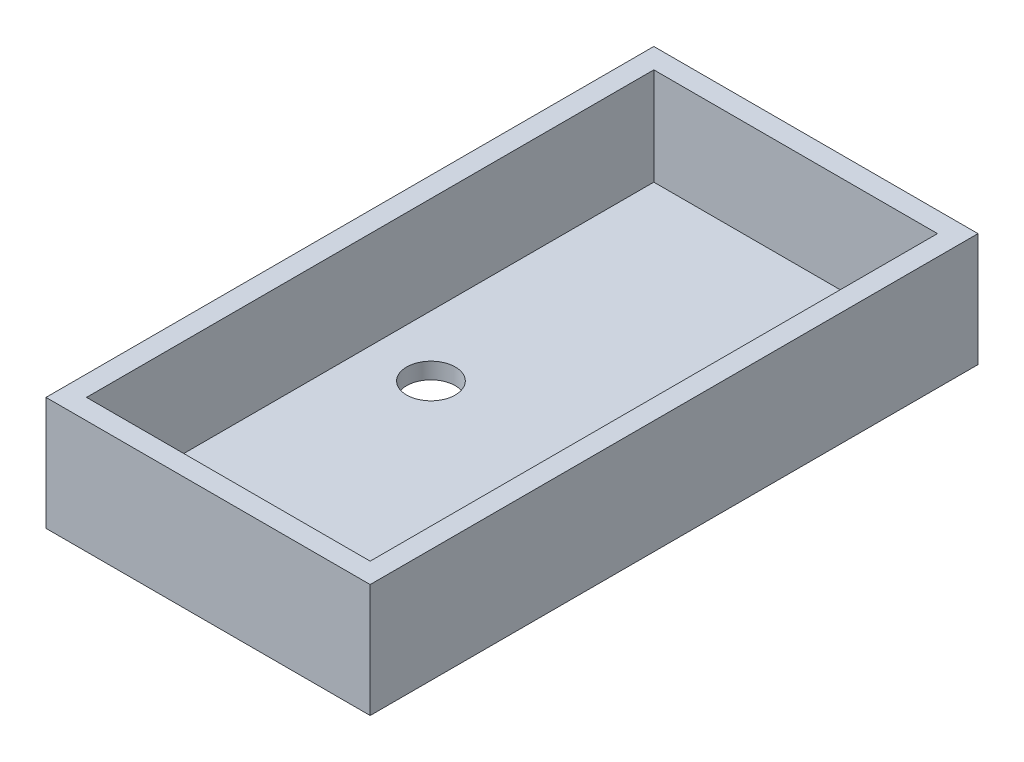
ISO-10303-21;
HEADER;
FILE_DESCRIPTION(('STEP AP214'),'2;1');
FILE_NAME('part.step','',(''),(''),'','','');
FILE_SCHEMA(('AUTOMOTIVE_DESIGN { 1 0 10303 214 1 1 1 1 }'));
ENDSEC;
DATA;
#1=APPLICATION_CONTEXT('core data for automotive mechanical design processes');
#2=APPLICATION_PROTOCOL_DEFINITION('international standard','automotive_design',2000,#1);
#3=PRODUCT_CONTEXT('',#1,'mechanical');
#4=PRODUCT('Part','Part','',(#3));
#5=PRODUCT_RELATED_PRODUCT_CATEGORY('part','',(#4));
#6=PRODUCT_DEFINITION_FORMATION('','',#4);
#7=PRODUCT_DEFINITION_CONTEXT('part definition',#1,'design');
#8=PRODUCT_DEFINITION('design','',#6,#7);
#9=PRODUCT_DEFINITION_SHAPE('','',#8);
#10=(LENGTH_UNIT() NAMED_UNIT(*) SI_UNIT(.MILLI.,.METRE.));
#11=(NAMED_UNIT(*) PLANE_ANGLE_UNIT() SI_UNIT($,.RADIAN.));
#12=(NAMED_UNIT(*) SI_UNIT($,.STERADIAN.) SOLID_ANGLE_UNIT());
#13=UNCERTAINTY_MEASURE_WITH_UNIT(LENGTH_MEASURE(1.E-05),#10,'distance_accuracy_value','');
#14=(GEOMETRIC_REPRESENTATION_CONTEXT(3) GLOBAL_UNCERTAINTY_ASSIGNED_CONTEXT((#13)) GLOBAL_UNIT_ASSIGNED_CONTEXT((#10,
#11,#12)) REPRESENTATION_CONTEXT('',''));
#15=CARTESIAN_POINT('',(0.,0.,0.));
#16=DIRECTION('',(0.,0.,1.));
#17=DIRECTION('',(1.,0.,0.));
#18=AXIS2_PLACEMENT_3D('',#15,#16,#17);
#19=CARTESIAN_POINT('',(0.,14.,0.));
#20=DIRECTION('',(0.,1.,0.));
#21=DIRECTION('',(0.,0.,1.));
#22=AXIS2_PLACEMENT_3D('',#19,#20,#21);
#23=PLANE('',#22);
#24=DIRECTION('',(0.,0.,-1.));
#25=VECTOR('',#24,1.);
#26=CARTESIAN_POINT('',(17.5,14.,-35.));
#27=LINE('',#26,#25);
#28=CARTESIAN_POINT('',(17.5,14.,35.));
#29=VERTEX_POINT('',#28);
#30=CARTESIAN_POINT('',(17.5,14.,-35.));
#31=VERTEX_POINT('',#30);
#32=EDGE_CURVE('E55',#29,#31,#27,.T.);
#33=ORIENTED_EDGE('',*,*,#32,.F.);
#34=DIRECTION('',(1.,0.,0.));
#35=VECTOR('',#34,1.);
#36=CARTESIAN_POINT('',(-17.5,14.,35.));
#37=LINE('',#36,#35);
#38=CARTESIAN_POINT('',(-17.5,14.,35.));
#39=VERTEX_POINT('',#38);
#40=EDGE_CURVE('E134',#39,#29,#37,.T.);
#41=ORIENTED_EDGE('',*,*,#40,.F.);
#42=DIRECTION('',(0.,0.,1.));
#43=VECTOR('',#42,1.);
#44=CARTESIAN_POINT('',(-17.5,14.,-35.));
#45=LINE('',#44,#43);
#46=CARTESIAN_POINT('',(-17.5,14.,-35.));
#47=VERTEX_POINT('',#46);
#48=EDGE_CURVE('E137',#47,#39,#45,.T.);
#49=ORIENTED_EDGE('',*,*,#48,.F.);
#50=DIRECTION('',(-1.,0.,0.));
#51=VECTOR('',#50,1.);
#52=CARTESIAN_POINT('',(-17.5,14.,-35.));
#53=LINE('',#52,#51);
#54=EDGE_CURVE('E146',#31,#47,#53,.T.);
#55=ORIENTED_EDGE('',*,*,#54,.F.);
#56=EDGE_LOOP('',(#33,#41,#49,#55));
#57=FACE_BOUND('',#56,.T.);
#58=DIRECTION('',(0.,0.,-1.));
#59=VECTOR('',#58,1.);
#60=CARTESIAN_POINT('',(20.,14.,-37.5));
#61=LINE('',#60,#59);
#62=CARTESIAN_POINT('',(20.,14.,37.5));
#63=VERTEX_POINT('',#62);
#64=CARTESIAN_POINT('',(20.,14.,-37.5));
#65=VERTEX_POINT('',#64);
#66=EDGE_CURVE('E157',#63,#65,#61,.T.);
#67=ORIENTED_EDGE('',*,*,#66,.T.);
#68=DIRECTION('',(-1.,0.,0.));
#69=VECTOR('',#68,1.);
#70=CARTESIAN_POINT('',(-20.,14.,-37.5));
#71=LINE('',#70,#69);
#72=CARTESIAN_POINT('',(-20.,14.,-37.5));
#73=VERTEX_POINT('',#72);
#74=EDGE_CURVE('E92',#65,#73,#71,.T.);
#75=ORIENTED_EDGE('',*,*,#74,.T.);
#76=DIRECTION('',(0.,0.,1.));
#77=VECTOR('',#76,1.);
#78=CARTESIAN_POINT('',(-20.,14.,-37.5));
#79=LINE('',#78,#77);
#80=CARTESIAN_POINT('',(-20.,14.,37.5));
#81=VERTEX_POINT('',#80);
#82=EDGE_CURVE('E161',#73,#81,#79,.T.);
#83=ORIENTED_EDGE('',*,*,#82,.T.);
#84=DIRECTION('',(1.,0.,0.));
#85=VECTOR('',#84,1.);
#86=CARTESIAN_POINT('',(-20.,14.,37.5));
#87=LINE('',#86,#85);
#88=EDGE_CURVE('E64',#81,#63,#87,.T.);
#89=ORIENTED_EDGE('',*,*,#88,.T.);
#90=EDGE_LOOP('',(#67,#75,#83,#89));
#91=FACE_BOUND('',#90,.T.);
#92=ADVANCED_FACE('F40',(#57,#91),#23,.T.);
#93=CARTESIAN_POINT('',(0.,0.,0.));
#94=DIRECTION('',(0.,1.,0.));
#95=DIRECTION('',(0.,0.,1.));
#96=AXIS2_PLACEMENT_3D('',#93,#94,#95);
#97=PLANE('',#96);
#98=CARTESIAN_POINT('',(-9.99999999999999,0.,0.));
#99=DIRECTION('',(0.,1.,0.));
#100=DIRECTION('',(0.,0.,1.));
#101=AXIS2_PLACEMENT_3D('',#98,#99,#100);
#102=CIRCLE('',#101,3.);
#103=CARTESIAN_POINT('',(-9.99999999999999,0.,3.));
#104=VERTEX_POINT('',#103);
#105=EDGE_CURVE('E147',#104,#104,#102,.T.);
#106=ORIENTED_EDGE('',*,*,#105,.T.);
#107=EDGE_LOOP('',(#106));
#108=FACE_BOUND('',#107,.T.);
#109=CARTESIAN_POINT('',(10.,0.,0.));
#110=DIRECTION('',(0.,1.,0.));
#111=DIRECTION('',(0.,0.,1.));
#112=AXIS2_PLACEMENT_3D('',#109,#110,#111);
#113=CIRCLE('',#112,3.);
#114=CARTESIAN_POINT('',(10.,0.,3.));
#115=VERTEX_POINT('',#114);
#116=EDGE_CURVE('E236',#115,#115,#113,.T.);
#117=ORIENTED_EDGE('',*,*,#116,.T.);
#118=EDGE_LOOP('',(#117));
#119=FACE_BOUND('',#118,.T.);
#120=DIRECTION('',(0.,0.,-1.));
#121=VECTOR('',#120,1.);
#122=CARTESIAN_POINT('',(20.,0.,-37.5));
#123=LINE('',#122,#121);
#124=CARTESIAN_POINT('',(20.,0.,37.5));
#125=VERTEX_POINT('',#124);
#126=CARTESIAN_POINT('',(20.,0.,-37.5));
#127=VERTEX_POINT('',#126);
#128=EDGE_CURVE('E153',#125,#127,#123,.T.);
#129=ORIENTED_EDGE('',*,*,#128,.F.);
#130=DIRECTION('',(1.,0.,0.));
#131=VECTOR('',#130,1.);
#132=CARTESIAN_POINT('',(-20.,0.,37.5));
#133=LINE('',#132,#131);
#134=CARTESIAN_POINT('',(-20.,0.,37.5));
#135=VERTEX_POINT('',#134);
#136=EDGE_CURVE('E85',#135,#125,#133,.T.);
#137=ORIENTED_EDGE('',*,*,#136,.F.);
#138=DIRECTION('',(0.,0.,1.));
#139=VECTOR('',#138,1.);
#140=CARTESIAN_POINT('',(-20.,0.,-37.5));
#141=LINE('',#140,#139);
#142=CARTESIAN_POINT('',(-20.,0.,-37.5));
#143=VERTEX_POINT('',#142);
#144=EDGE_CURVE('E170',#143,#135,#141,.T.);
#145=ORIENTED_EDGE('',*,*,#144,.F.);
#146=DIRECTION('',(-1.,0.,0.));
#147=VECTOR('',#146,1.);
#148=CARTESIAN_POINT('',(-20.,0.,-37.5));
#149=LINE('',#148,#147);
#150=EDGE_CURVE('E168',#127,#143,#149,.T.);
#151=ORIENTED_EDGE('',*,*,#150,.F.);
#152=EDGE_LOOP('',(#129,#137,#145,#151));
#153=FACE_BOUND('',#152,.T.);
#154=ADVANCED_FACE('F185',(#108,#119,#153),#97,.F.);
#155=CARTESIAN_POINT('',(20.,14.,-37.5));
#156=DIRECTION('',(-1.,0.,0.));
#157=DIRECTION('',(0.,0.,1.));
#158=AXIS2_PLACEMENT_3D('',#155,#156,#157);
#159=PLANE('',#158);
#160=ORIENTED_EDGE('',*,*,#128,.T.);
#161=DIRECTION('',(0.,-1.,0.));
#162=VECTOR('',#161,1.);
#163=CARTESIAN_POINT('',(20.,14.,-37.5));
#164=LINE('',#163,#162);
#165=EDGE_CURVE('E11',#65,#127,#164,.T.);
#166=ORIENTED_EDGE('',*,*,#165,.F.);
#167=ORIENTED_EDGE('',*,*,#66,.F.);
#168=DIRECTION('',(0.,-1.,0.));
#169=VECTOR('',#168,1.);
#170=CARTESIAN_POINT('',(20.,14.,37.5));
#171=LINE('',#170,#169);
#172=EDGE_CURVE('E165',#63,#125,#171,.T.);
#173=ORIENTED_EDGE('',*,*,#172,.T.);
#174=EDGE_LOOP('',(#160,#166,#167,#173));
#175=FACE_BOUND('',#174,.T.);
#176=ADVANCED_FACE('F42',(#175),#159,.F.);
#177=CARTESIAN_POINT('',(-20.,14.,-37.5));
#178=DIRECTION('',(0.,0.,1.));
#179=DIRECTION('',(1.,0.,0.));
#180=AXIS2_PLACEMENT_3D('',#177,#178,#179);
#181=PLANE('',#180);
#182=ORIENTED_EDGE('',*,*,#150,.T.);
#183=DIRECTION('',(0.,-1.,0.));
#184=VECTOR('',#183,1.);
#185=CARTESIAN_POINT('',(-20.,14.,-37.5));
#186=LINE('',#185,#184);
#187=EDGE_CURVE('E48',#73,#143,#186,.T.);
#188=ORIENTED_EDGE('',*,*,#187,.F.);
#189=ORIENTED_EDGE('',*,*,#74,.F.);
#190=ORIENTED_EDGE('',*,*,#165,.T.);
#191=EDGE_LOOP('',(#182,#188,#189,#190));
#192=FACE_BOUND('',#191,.T.);
#193=ADVANCED_FACE('F198',(#192),#181,.F.);
#194=CARTESIAN_POINT('',(-20.,14.,-37.5));
#195=DIRECTION('',(1.,0.,0.));
#196=DIRECTION('',(0.,0.,-1.));
#197=AXIS2_PLACEMENT_3D('',#194,#195,#196);
#198=PLANE('',#197);
#199=ORIENTED_EDGE('',*,*,#144,.T.);
#200=DIRECTION('',(0.,-1.,0.));
#201=VECTOR('',#200,1.);
#202=CARTESIAN_POINT('',(-20.,14.,37.5));
#203=LINE('',#202,#201);
#204=EDGE_CURVE('E176',#81,#135,#203,.T.);
#205=ORIENTED_EDGE('',*,*,#204,.F.);
#206=ORIENTED_EDGE('',*,*,#82,.F.);
#207=ORIENTED_EDGE('',*,*,#187,.T.);
#208=EDGE_LOOP('',(#199,#205,#206,#207));
#209=FACE_BOUND('',#208,.T.);
#210=ADVANCED_FACE('F181',(#209),#198,.F.);
#211=CARTESIAN_POINT('',(-20.,14.,37.5));
#212=DIRECTION('',(0.,0.,-1.));
#213=DIRECTION('',(-1.,0.,0.));
#214=AXIS2_PLACEMENT_3D('',#211,#212,#213);
#215=PLANE('',#214);
#216=ORIENTED_EDGE('',*,*,#136,.T.);
#217=ORIENTED_EDGE('',*,*,#172,.F.);
#218=ORIENTED_EDGE('',*,*,#88,.F.);
#219=ORIENTED_EDGE('',*,*,#204,.T.);
#220=EDGE_LOOP('',(#216,#217,#218,#219));
#221=FACE_BOUND('',#220,.T.);
#222=ADVANCED_FACE('F189',(#221),#215,.F.);
#223=CARTESIAN_POINT('',(17.5,2.,-35.));
#224=DIRECTION('',(1.,0.,0.));
#225=DIRECTION('',(0.,0.,-1.));
#226=AXIS2_PLACEMENT_3D('',#223,#224,#225);
#227=PLANE('',#226);
#228=ORIENTED_EDGE('',*,*,#32,.T.);
#229=DIRECTION('',(0.,1.,0.));
#230=VECTOR('',#229,1.);
#231=CARTESIAN_POINT('',(17.5,2.,-35.));
#232=LINE('',#231,#230);
#233=CARTESIAN_POINT('',(17.5,2.,-35.));
#234=VERTEX_POINT('',#233);
#235=EDGE_CURVE('E112',#234,#31,#232,.T.);
#236=ORIENTED_EDGE('',*,*,#235,.F.);
#237=DIRECTION('',(0.,0.,-1.));
#238=VECTOR('',#237,1.);
#239=CARTESIAN_POINT('',(17.5,2.,-35.));
#240=LINE('',#239,#238);
#241=CARTESIAN_POINT('',(17.5,2.,35.));
#242=VERTEX_POINT('',#241);
#243=EDGE_CURVE('E116',#242,#234,#240,.T.);
#244=ORIENTED_EDGE('',*,*,#243,.F.);
#245=DIRECTION('',(0.,1.,0.));
#246=VECTOR('',#245,1.);
#247=CARTESIAN_POINT('',(17.5,2.,35.));
#248=LINE('',#247,#246);
#249=EDGE_CURVE('E151',#242,#29,#248,.T.);
#250=ORIENTED_EDGE('',*,*,#249,.T.);
#251=EDGE_LOOP('',(#228,#236,#244,#250));
#252=FACE_BOUND('',#251,.T.);
#253=ADVANCED_FACE('F114',(#252),#227,.F.);
#254=CARTESIAN_POINT('',(-17.5,2.,35.));
#255=DIRECTION('',(0.,0.,1.));
#256=DIRECTION('',(1.,0.,0.));
#257=AXIS2_PLACEMENT_3D('',#254,#255,#256);
#258=PLANE('',#257);
#259=ORIENTED_EDGE('',*,*,#40,.T.);
#260=ORIENTED_EDGE('',*,*,#249,.F.);
#261=DIRECTION('',(1.,0.,0.));
#262=VECTOR('',#261,1.);
#263=CARTESIAN_POINT('',(-17.5,2.,35.));
#264=LINE('',#263,#262);
#265=CARTESIAN_POINT('',(-17.5,2.,35.));
#266=VERTEX_POINT('',#265);
#267=EDGE_CURVE('E122',#266,#242,#264,.T.);
#268=ORIENTED_EDGE('',*,*,#267,.F.);
#269=DIRECTION('',(0.,1.,0.));
#270=VECTOR('',#269,1.);
#271=CARTESIAN_POINT('',(-17.5,2.,35.));
#272=LINE('',#271,#270);
#273=EDGE_CURVE('E154',#266,#39,#272,.T.);
#274=ORIENTED_EDGE('',*,*,#273,.T.);
#275=EDGE_LOOP('',(#259,#260,#268,#274));
#276=FACE_BOUND('',#275,.T.);
#277=ADVANCED_FACE('F196',(#276),#258,.F.);
#278=CARTESIAN_POINT('',(-17.5,2.,-35.));
#279=DIRECTION('',(-1.,0.,0.));
#280=DIRECTION('',(0.,0.,1.));
#281=AXIS2_PLACEMENT_3D('',#278,#279,#280);
#282=PLANE('',#281);
#283=ORIENTED_EDGE('',*,*,#48,.T.);
#284=ORIENTED_EDGE('',*,*,#273,.F.);
#285=DIRECTION('',(0.,0.,1.));
#286=VECTOR('',#285,1.);
#287=CARTESIAN_POINT('',(-17.5,2.,-35.));
#288=LINE('',#287,#286);
#289=CARTESIAN_POINT('',(-17.5,2.,-35.));
#290=VERTEX_POINT('',#289);
#291=EDGE_CURVE('E130',#290,#266,#288,.T.);
#292=ORIENTED_EDGE('',*,*,#291,.F.);
#293=DIRECTION('',(0.,1.,0.));
#294=VECTOR('',#293,1.);
#295=CARTESIAN_POINT('',(-17.5,2.,-35.));
#296=LINE('',#295,#294);
#297=EDGE_CURVE('E121',#290,#47,#296,.T.);
#298=ORIENTED_EDGE('',*,*,#297,.T.);
#299=EDGE_LOOP('',(#283,#284,#292,#298));
#300=FACE_BOUND('',#299,.T.);
#301=ADVANCED_FACE('F211',(#300),#282,.F.);
#302=CARTESIAN_POINT('',(-17.5,2.,-35.));
#303=DIRECTION('',(0.,0.,-1.));
#304=DIRECTION('',(-1.,0.,0.));
#305=AXIS2_PLACEMENT_3D('',#302,#303,#304);
#306=PLANE('',#305);
#307=ORIENTED_EDGE('',*,*,#54,.T.);
#308=ORIENTED_EDGE('',*,*,#297,.F.);
#309=DIRECTION('',(-1.,0.,0.));
#310=VECTOR('',#309,1.);
#311=CARTESIAN_POINT('',(-17.5,2.,-35.));
#312=LINE('',#311,#310);
#313=EDGE_CURVE('E125',#234,#290,#312,.T.);
#314=ORIENTED_EDGE('',*,*,#313,.F.);
#315=ORIENTED_EDGE('',*,*,#235,.T.);
#316=EDGE_LOOP('',(#307,#308,#314,#315));
#317=FACE_BOUND('',#316,.T.);
#318=ADVANCED_FACE('F126',(#317),#306,.F.);
#319=CARTESIAN_POINT('',(0.,2.,0.));
#320=DIRECTION('',(0.,1.,0.));
#321=DIRECTION('',(0.,0.,1.));
#322=AXIS2_PLACEMENT_3D('',#319,#320,#321);
#323=PLANE('',#322);
#324=CARTESIAN_POINT('',(-9.99999999999999,2.,0.));
#325=DIRECTION('',(0.,1.,0.));
#326=DIRECTION('',(0.,0.,1.));
#327=AXIS2_PLACEMENT_3D('',#324,#325,#326);
#328=CIRCLE('',#327,3.);
#329=CARTESIAN_POINT('',(-9.99999999999999,2.,3.));
#330=VERTEX_POINT('',#329);
#331=EDGE_CURVE('E235',#330,#330,#328,.T.);
#332=ORIENTED_EDGE('',*,*,#331,.F.);
#333=EDGE_LOOP('',(#332));
#334=FACE_BOUND('',#333,.T.);
#335=CARTESIAN_POINT('',(10.,2.,0.));
#336=DIRECTION('',(0.,1.,0.));
#337=DIRECTION('',(0.,0.,1.));
#338=AXIS2_PLACEMENT_3D('',#335,#336,#337);
#339=CIRCLE('',#338,3.);
#340=CARTESIAN_POINT('',(10.,2.,3.));
#341=VERTEX_POINT('',#340);
#342=EDGE_CURVE('E140',#341,#341,#339,.T.);
#343=ORIENTED_EDGE('',*,*,#342,.F.);
#344=EDGE_LOOP('',(#343));
#345=FACE_BOUND('',#344,.T.);
#346=ORIENTED_EDGE('',*,*,#243,.T.);
#347=ORIENTED_EDGE('',*,*,#313,.T.);
#348=ORIENTED_EDGE('',*,*,#291,.T.);
#349=ORIENTED_EDGE('',*,*,#267,.T.);
#350=EDGE_LOOP('',(#346,#347,#348,#349));
#351=FACE_BOUND('',#350,.T.);
#352=ADVANCED_FACE('F132',(#334,#345,#351),#323,.T.);
#353=CARTESIAN_POINT('',(10.,0.,0.));
#354=DIRECTION('',(0.,1.,0.));
#355=DIRECTION('',(0.,0.,1.));
#356=AXIS2_PLACEMENT_3D('',#353,#354,#355);
#357=CYLINDRICAL_SURFACE('',#356,3.);
#358=ORIENTED_EDGE('',*,*,#116,.F.);
#359=EDGE_LOOP('',(#358));
#360=FACE_BOUND('',#359,.T.);
#361=ORIENTED_EDGE('',*,*,#342,.T.);
#362=EDGE_LOOP('',(#361));
#363=FACE_BOUND('',#362,.T.);
#364=ADVANCED_FACE('F220',(#360,#363),#357,.F.);
#365=CARTESIAN_POINT('',(-9.99999999999999,0.,0.));
#366=DIRECTION('',(0.,1.,0.));
#367=DIRECTION('',(0.,0.,1.));
#368=AXIS2_PLACEMENT_3D('',#365,#366,#367);
#369=CYLINDRICAL_SURFACE('',#368,3.);
#370=ORIENTED_EDGE('',*,*,#105,.F.);
#371=EDGE_LOOP('',(#370));
#372=FACE_BOUND('',#371,.T.);
#373=ORIENTED_EDGE('',*,*,#331,.T.);
#374=EDGE_LOOP('',(#373));
#375=FACE_BOUND('',#374,.T.);
#376=ADVANCED_FACE('F224',(#372,#375),#369,.F.);
#377=CLOSED_SHELL('',(#92,#154,#176,#193,#210,#222,#253,#277,#301,#318,#352,#364,#376));
#378=MANIFOLD_SOLID_BREP('B2',#377);
#379=ADVANCED_BREP_SHAPE_REPRESENTATION('',(#18,#378),#14);
#380=SHAPE_DEFINITION_REPRESENTATION(#9,#379);
ENDSEC;
END-ISO-10303-21;
